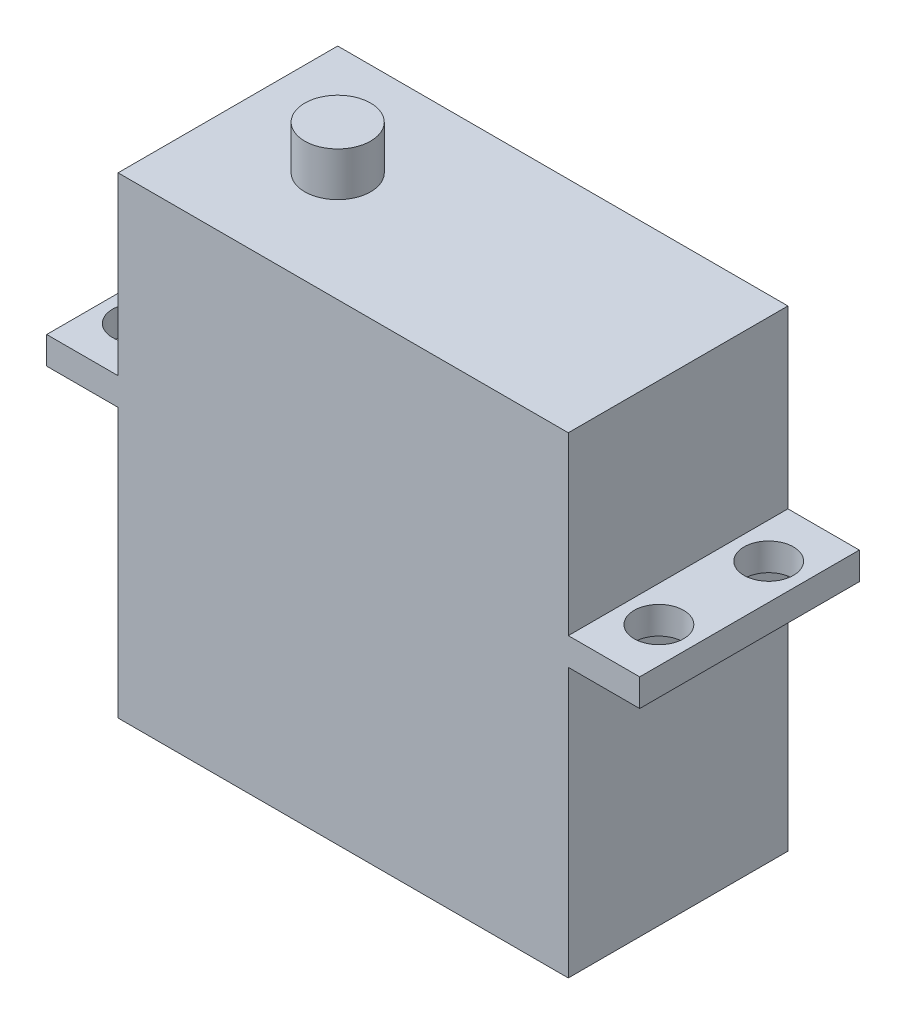
ISO-10303-21;
HEADER;
FILE_DESCRIPTION(('STEP AP214'),'2;1');
FILE_NAME('part.step','',(''),(''),'','','');
FILE_SCHEMA(('AUTOMOTIVE_DESIGN { 1 0 10303 214 1 1 1 1 }'));
ENDSEC;
DATA;
#1=APPLICATION_CONTEXT('core data for automotive mechanical design processes');
#2=APPLICATION_PROTOCOL_DEFINITION('international standard','automotive_design',2000,#1);
#3=PRODUCT_CONTEXT('',#1,'mechanical');
#4=PRODUCT('Part','Part','',(#3));
#5=PRODUCT_RELATED_PRODUCT_CATEGORY('part','',(#4));
#6=PRODUCT_DEFINITION_FORMATION('','',#4);
#7=PRODUCT_DEFINITION_CONTEXT('part definition',#1,'design');
#8=PRODUCT_DEFINITION('design','',#6,#7);
#9=PRODUCT_DEFINITION_SHAPE('','',#8);
#10=(LENGTH_UNIT() NAMED_UNIT(*) SI_UNIT(.MILLI.,.METRE.));
#11=(NAMED_UNIT(*) PLANE_ANGLE_UNIT() SI_UNIT($,.RADIAN.));
#12=(NAMED_UNIT(*) SI_UNIT($,.STERADIAN.) SOLID_ANGLE_UNIT());
#13=UNCERTAINTY_MEASURE_WITH_UNIT(LENGTH_MEASURE(1.E-05),#10,'distance_accuracy_value','');
#14=(GEOMETRIC_REPRESENTATION_CONTEXT(3) GLOBAL_UNCERTAINTY_ASSIGNED_CONTEXT((#13)) GLOBAL_UNIT_ASSIGNED_CONTEXT((#10,
#11,#12)) REPRESENTATION_CONTEXT('',''));
#15=CARTESIAN_POINT('',(0.,0.,0.));
#16=DIRECTION('',(0.,0.,1.));
#17=DIRECTION('',(1.,0.,0.));
#18=AXIS2_PLACEMENT_3D('',#15,#16,#17);
#19=CARTESIAN_POINT('',(-16.5,27.,-10.));
#20=DIRECTION('',(0.,-1.,0.));
#21=DIRECTION('',(0.,0.,-1.));
#22=AXIS2_PLACEMENT_3D('',#19,#20,#21);
#23=PLANE('',#22);
#24=CARTESIAN_POINT('',(-13.2502925364573,27.,5.));
#25=DIRECTION('',(0.,1.,0.));
#26=DIRECTION('',(0.,0.,1.));
#27=AXIS2_PLACEMENT_3D('',#24,#25,#26);
#28=CIRCLE('',#27,2.25);
#29=CARTESIAN_POINT('',(-13.2502925364573,27.,7.25));
#30=VERTEX_POINT('',#29);
#31=EDGE_CURVE('E236',#30,#30,#28,.T.);
#32=ORIENTED_EDGE('',*,*,#31,.F.);
#33=EDGE_LOOP('',(#32));
#34=FACE_BOUND('',#33,.T.);
#35=DIRECTION('',(1.,0.,0.));
#36=VECTOR('',#35,1.);
#37=CARTESIAN_POINT('',(-16.5,27.,10.));
#38=LINE('',#37,#36);
#39=CARTESIAN_POINT('',(-16.5,27.,10.));
#40=VERTEX_POINT('',#39);
#41=CARTESIAN_POINT('',(-10.,27.,10.));
#42=VERTEX_POINT('',#41);
#43=EDGE_CURVE('E165',#40,#42,#38,.T.);
#44=ORIENTED_EDGE('',*,*,#43,.T.);
#45=DIRECTION('',(0.,0.,-1.));
#46=VECTOR('',#45,1.);
#47=CARTESIAN_POINT('',(-10.,27.,-10.));
#48=LINE('',#47,#46);
#49=CARTESIAN_POINT('',(-10.,27.,-10.));
#50=VERTEX_POINT('',#49);
#51=EDGE_CURVE('E192',#42,#50,#48,.T.);
#52=ORIENTED_EDGE('',*,*,#51,.T.);
#53=DIRECTION('',(1.,0.,0.));
#54=VECTOR('',#53,1.);
#55=CARTESIAN_POINT('',(-16.5,27.,-10.));
#56=LINE('',#55,#54);
#57=CARTESIAN_POINT('',(-16.5,27.,-10.));
#58=VERTEX_POINT('',#57);
#59=EDGE_CURVE('E149',#58,#50,#56,.T.);
#60=ORIENTED_EDGE('',*,*,#59,.F.);
#61=DIRECTION('',(0.,0.,1.));
#62=VECTOR('',#61,1.);
#63=CARTESIAN_POINT('',(-16.5,27.,-10.));
#64=LINE('',#63,#62);
#65=EDGE_CURVE('E181',#58,#40,#64,.T.);
#66=ORIENTED_EDGE('',*,*,#65,.T.);
#67=EDGE_LOOP('',(#44,#52,#60,#66));
#68=FACE_BOUND('',#67,.T.);
#69=CARTESIAN_POINT('',(-13.2502925364573,27.,-5.));
#70=DIRECTION('',(0.,1.,0.));
#71=DIRECTION('',(0.,0.,1.));
#72=AXIS2_PLACEMENT_3D('',#69,#70,#71);
#73=CIRCLE('',#72,2.25);
#74=CARTESIAN_POINT('',(-13.2502925364573,27.,-2.75));
#75=VERTEX_POINT('',#74);
#76=EDGE_CURVE('E246',#75,#75,#73,.T.);
#77=ORIENTED_EDGE('',*,*,#76,.F.);
#78=EDGE_LOOP('',(#77));
#79=FACE_BOUND('',#78,.T.);
#80=ADVANCED_FACE('F51',(#34,#68,#79),#23,.F.);
#81=CARTESIAN_POINT('',(-10.,43.,-10.));
#82=DIRECTION('',(1.,0.,0.));
#83=DIRECTION('',(0.,0.,-1.));
#84=AXIS2_PLACEMENT_3D('',#81,#82,#83);
#85=PLANE('',#84);
#86=ORIENTED_EDGE('',*,*,#51,.F.);
#87=DIRECTION('',(0.,-1.,0.));
#88=VECTOR('',#87,1.);
#89=CARTESIAN_POINT('',(-10.,43.,10.));
#90=LINE('',#89,#88);
#91=CARTESIAN_POINT('',(-10.,43.,10.));
#92=VERTEX_POINT('',#91);
#93=EDGE_CURVE('E226',#92,#42,#90,.T.);
#94=ORIENTED_EDGE('',*,*,#93,.F.);
#95=DIRECTION('',(0.,0.,1.));
#96=VECTOR('',#95,1.);
#97=CARTESIAN_POINT('',(-10.,43.,-10.));
#98=LINE('',#97,#96);
#99=CARTESIAN_POINT('',(-10.,43.,-10.));
#100=VERTEX_POINT('',#99);
#101=EDGE_CURVE('E209',#100,#92,#98,.T.);
#102=ORIENTED_EDGE('',*,*,#101,.F.);
#103=DIRECTION('',(0.,-1.,0.));
#104=VECTOR('',#103,1.);
#105=CARTESIAN_POINT('',(-10.,43.,-10.));
#106=LINE('',#105,#104);
#107=EDGE_CURVE('E199',#100,#50,#106,.T.);
#108=ORIENTED_EDGE('',*,*,#107,.T.);
#109=EDGE_LOOP('',(#86,#94,#102,#108));
#110=FACE_BOUND('',#109,.T.);
#111=ADVANCED_FACE('F289',(#110),#85,.F.);
#112=CARTESIAN_POINT('',(31.,43.,-10.));
#113=DIRECTION('',(1.,0.,0.));
#114=DIRECTION('',(0.,0.,-1.));
#115=AXIS2_PLACEMENT_3D('',#112,#113,#114);
#116=PLANE('',#115);
#117=DIRECTION('',(0.,-1.,0.));
#118=VECTOR('',#117,1.);
#119=CARTESIAN_POINT('',(31.,43.,10.));
#120=LINE('',#119,#118);
#121=CARTESIAN_POINT('',(31.,43.,10.));
#122=VERTEX_POINT('',#121);
#123=CARTESIAN_POINT('',(31.,27.,10.));
#124=VERTEX_POINT('',#123);
#125=EDGE_CURVE('E228',#122,#124,#120,.T.);
#126=ORIENTED_EDGE('',*,*,#125,.T.);
#127=DIRECTION('',(0.,0.,-1.));
#128=VECTOR('',#127,1.);
#129=CARTESIAN_POINT('',(31.,27.,-10.));
#130=LINE('',#129,#128);
#131=CARTESIAN_POINT('',(31.,27.,-10.));
#132=VERTEX_POINT('',#131);
#133=EDGE_CURVE('E13',#124,#132,#130,.T.);
#134=ORIENTED_EDGE('',*,*,#133,.T.);
#135=DIRECTION('',(0.,-1.,0.));
#136=VECTOR('',#135,1.);
#137=CARTESIAN_POINT('',(31.,43.,-10.));
#138=LINE('',#137,#136);
#139=CARTESIAN_POINT('',(31.,43.,-10.));
#140=VERTEX_POINT('',#139);
#141=EDGE_CURVE('E235',#140,#132,#138,.T.);
#142=ORIENTED_EDGE('',*,*,#141,.F.);
#143=DIRECTION('',(0.,0.,1.));
#144=VECTOR('',#143,1.);
#145=CARTESIAN_POINT('',(31.,43.,-10.));
#146=LINE('',#145,#144);
#147=EDGE_CURVE('E204',#140,#122,#146,.T.);
#148=ORIENTED_EDGE('',*,*,#147,.T.);
#149=EDGE_LOOP('',(#126,#134,#142,#148));
#150=FACE_BOUND('',#149,.T.);
#151=ADVANCED_FACE('F281',(#150),#116,.T.);
#152=CARTESIAN_POINT('',(-10.,43.,-10.));
#153=DIRECTION('',(0.,0.,-1.));
#154=DIRECTION('',(-1.,0.,0.));
#155=AXIS2_PLACEMENT_3D('',#152,#153,#154);
#156=PLANE('',#155);
#157=ORIENTED_EDGE('',*,*,#141,.T.);
#158=CARTESIAN_POINT('',(37.5,27.,-10.));
#159=VERTEX_POINT('',#158);
#160=EDGE_CURVE('E178',#132,#159,#56,.T.);
#161=ORIENTED_EDGE('',*,*,#160,.T.);
#162=DIRECTION('',(0.,-1.,0.));
#163=VECTOR('',#162,1.);
#164=CARTESIAN_POINT('',(37.5,27.,-10.));
#165=LINE('',#164,#163);
#166=CARTESIAN_POINT('',(37.5,24.5,-10.));
#167=VERTEX_POINT('',#166);
#168=EDGE_CURVE('E180',#159,#167,#165,.T.);
#169=ORIENTED_EDGE('',*,*,#168,.T.);
#170=DIRECTION('',(1.,0.,0.));
#171=VECTOR('',#170,1.);
#172=CARTESIAN_POINT('',(-16.5,24.5,-10.));
#173=LINE('',#172,#171);
#174=CARTESIAN_POINT('',(31.,24.5,-10.));
#175=VERTEX_POINT('',#174);
#176=EDGE_CURVE('E174',#175,#167,#173,.T.);
#177=ORIENTED_EDGE('',*,*,#176,.F.);
#178=CARTESIAN_POINT('',(31.,0.,-10.));
#179=VERTEX_POINT('',#178);
#180=EDGE_CURVE('E215',#175,#179,#138,.T.);
#181=ORIENTED_EDGE('',*,*,#180,.T.);
#182=DIRECTION('',(1.,0.,0.));
#183=VECTOR('',#182,1.);
#184=CARTESIAN_POINT('',(-10.,0.,-10.));
#185=LINE('',#184,#183);
#186=CARTESIAN_POINT('',(-10.,0.,-10.));
#187=VERTEX_POINT('',#186);
#188=EDGE_CURVE('E198',#187,#179,#185,.T.);
#189=ORIENTED_EDGE('',*,*,#188,.F.);
#190=CARTESIAN_POINT('',(-10.,24.5,-10.));
#191=VERTEX_POINT('',#190);
#192=EDGE_CURVE('E223',#191,#187,#106,.T.);
#193=ORIENTED_EDGE('',*,*,#192,.F.);
#194=CARTESIAN_POINT('',(-16.5,24.5,-10.));
#195=VERTEX_POINT('',#194);
#196=EDGE_CURVE('E69',#195,#191,#173,.T.);
#197=ORIENTED_EDGE('',*,*,#196,.F.);
#198=DIRECTION('',(0.,-1.,0.));
#199=VECTOR('',#198,1.);
#200=CARTESIAN_POINT('',(-16.5,27.,-10.));
#201=LINE('',#200,#199);
#202=EDGE_CURVE('E150',#58,#195,#201,.T.);
#203=ORIENTED_EDGE('',*,*,#202,.F.);
#204=ORIENTED_EDGE('',*,*,#59,.T.);
#205=ORIENTED_EDGE('',*,*,#107,.F.);
#206=DIRECTION('',(1.,0.,0.));
#207=VECTOR('',#206,1.);
#208=CARTESIAN_POINT('',(-10.,43.,-10.));
#209=LINE('',#208,#207);
#210=EDGE_CURVE('E203',#100,#140,#209,.T.);
#211=ORIENTED_EDGE('',*,*,#210,.T.);
#212=EDGE_LOOP('',(#157,#161,#169,#177,#181,#189,#193,#197,#203,#204,#205,#211));
#213=FACE_BOUND('',#212,.T.);
#214=ADVANCED_FACE('F52',(#213),#156,.T.);
#215=CARTESIAN_POINT('',(-10.,24.5,10.));
#216=VERTEX_POINT('',#215);
#217=CARTESIAN_POINT('',(-10.,0.,10.));
#218=VERTEX_POINT('',#217);
#219=EDGE_CURVE('E227',#216,#218,#90,.T.);
#220=ORIENTED_EDGE('',*,*,#219,.F.);
#221=DIRECTION('',(0.,0.,-1.));
#222=VECTOR('',#221,1.);
#223=CARTESIAN_POINT('',(-10.,24.5,-10.));
#224=LINE('',#223,#222);
#225=EDGE_CURVE('E152',#216,#191,#224,.T.);
#226=ORIENTED_EDGE('',*,*,#225,.T.);
#227=ORIENTED_EDGE('',*,*,#192,.T.);
#228=DIRECTION('',(0.,0.,1.));
#229=VECTOR('',#228,1.);
#230=CARTESIAN_POINT('',(-10.,0.,-10.));
#231=LINE('',#230,#229);
#232=EDGE_CURVE('E202',#187,#218,#231,.T.);
#233=ORIENTED_EDGE('',*,*,#232,.T.);
#234=EDGE_LOOP('',(#220,#226,#227,#233));
#235=FACE_BOUND('',#234,.T.);
#236=ADVANCED_FACE('F296',(#235),#85,.F.);
#237=CARTESIAN_POINT('',(-10.,43.,10.));
#238=DIRECTION('',(0.,0.,-1.));
#239=DIRECTION('',(-1.,0.,0.));
#240=AXIS2_PLACEMENT_3D('',#237,#238,#239);
#241=PLANE('',#240);
#242=ORIENTED_EDGE('',*,*,#93,.T.);
#243=ORIENTED_EDGE('',*,*,#43,.F.);
#244=DIRECTION('',(0.,-1.,0.));
#245=VECTOR('',#244,1.);
#246=CARTESIAN_POINT('',(-16.5,27.,10.));
#247=LINE('',#246,#245);
#248=CARTESIAN_POINT('',(-16.5,24.5,10.));
#249=VERTEX_POINT('',#248);
#250=EDGE_CURVE('E145',#40,#249,#247,.T.);
#251=ORIENTED_EDGE('',*,*,#250,.T.);
#252=DIRECTION('',(1.,0.,0.));
#253=VECTOR('',#252,1.);
#254=CARTESIAN_POINT('',(-16.5,24.5,10.));
#255=LINE('',#254,#253);
#256=EDGE_CURVE('E155',#249,#216,#255,.T.);
#257=ORIENTED_EDGE('',*,*,#256,.T.);
#258=ORIENTED_EDGE('',*,*,#219,.T.);
#259=DIRECTION('',(1.,0.,0.));
#260=VECTOR('',#259,1.);
#261=CARTESIAN_POINT('',(-10.,0.,10.));
#262=LINE('',#261,#260);
#263=CARTESIAN_POINT('',(31.,0.,10.));
#264=VERTEX_POINT('',#263);
#265=EDGE_CURVE('E217',#218,#264,#262,.T.);
#266=ORIENTED_EDGE('',*,*,#265,.T.);
#267=CARTESIAN_POINT('',(31.,24.5,10.));
#268=VERTEX_POINT('',#267);
#269=EDGE_CURVE('E232',#268,#264,#120,.T.);
#270=ORIENTED_EDGE('',*,*,#269,.F.);
#271=CARTESIAN_POINT('',(37.5,24.5,10.));
#272=VERTEX_POINT('',#271);
#273=EDGE_CURVE('E158',#268,#272,#255,.T.);
#274=ORIENTED_EDGE('',*,*,#273,.T.);
#275=DIRECTION('',(0.,-1.,0.));
#276=VECTOR('',#275,1.);
#277=CARTESIAN_POINT('',(37.5,27.,10.));
#278=LINE('',#277,#276);
#279=CARTESIAN_POINT('',(37.5,27.,10.));
#280=VERTEX_POINT('',#279);
#281=EDGE_CURVE('E160',#280,#272,#278,.T.);
#282=ORIENTED_EDGE('',*,*,#281,.F.);
#283=EDGE_CURVE('E175',#124,#280,#38,.T.);
#284=ORIENTED_EDGE('',*,*,#283,.F.);
#285=ORIENTED_EDGE('',*,*,#125,.F.);
#286=DIRECTION('',(1.,0.,0.));
#287=VECTOR('',#286,1.);
#288=CARTESIAN_POINT('',(-10.,43.,10.));
#289=LINE('',#288,#287);
#290=EDGE_CURVE('E208',#92,#122,#289,.T.);
#291=ORIENTED_EDGE('',*,*,#290,.F.);
#292=EDGE_LOOP('',(#242,#243,#251,#257,#258,#266,#270,#274,#282,#284,#285,#291));
#293=FACE_BOUND('',#292,.T.);
#294=ADVANCED_FACE('F161',(#293),#241,.F.);
#295=DIRECTION('',(0.,0.,-1.));
#296=VECTOR('',#295,1.);
#297=CARTESIAN_POINT('',(31.,24.5,-10.));
#298=LINE('',#297,#296);
#299=EDGE_CURVE('E58',#268,#175,#298,.T.);
#300=ORIENTED_EDGE('',*,*,#299,.F.);
#301=ORIENTED_EDGE('',*,*,#269,.T.);
#302=DIRECTION('',(0.,0.,1.));
#303=VECTOR('',#302,1.);
#304=CARTESIAN_POINT('',(31.,0.,-10.));
#305=LINE('',#304,#303);
#306=EDGE_CURVE('E214',#179,#264,#305,.T.);
#307=ORIENTED_EDGE('',*,*,#306,.F.);
#308=ORIENTED_EDGE('',*,*,#180,.F.);
#309=EDGE_LOOP('',(#300,#301,#307,#308));
#310=FACE_BOUND('',#309,.T.);
#311=ADVANCED_FACE('F395',(#310),#116,.T.);
#312=CARTESIAN_POINT('',(0.,43.,0.));
#313=DIRECTION('',(0.,-1.,0.));
#314=DIRECTION('',(0.,0.,-1.));
#315=AXIS2_PLACEMENT_3D('',#312,#313,#314);
#316=PLANE('',#315);
#317=CARTESIAN_POINT('',(0.,43.,0.));
#318=DIRECTION('',(0.,1.,0.));
#319=DIRECTION('',(0.,0.,1.));
#320=AXIS2_PLACEMENT_3D('',#317,#318,#319);
#321=CIRCLE('',#320,3.);
#322=CARTESIAN_POINT('',(0.,43.,3.));
#323=VERTEX_POINT('',#322);
#324=EDGE_CURVE('E197',#323,#323,#321,.T.);
#325=ORIENTED_EDGE('',*,*,#324,.F.);
#326=EDGE_LOOP('',(#325));
#327=FACE_BOUND('',#326,.T.);
#328=ORIENTED_EDGE('',*,*,#210,.F.);
#329=ORIENTED_EDGE('',*,*,#101,.T.);
#330=ORIENTED_EDGE('',*,*,#290,.T.);
#331=ORIENTED_EDGE('',*,*,#147,.F.);
#332=EDGE_LOOP('',(#328,#329,#330,#331));
#333=FACE_BOUND('',#332,.T.);
#334=ADVANCED_FACE('F282',(#327,#333),#316,.F.);
#335=CARTESIAN_POINT('',(0.,0.,0.));
#336=DIRECTION('',(0.,-1.,0.));
#337=DIRECTION('',(0.,0.,-1.));
#338=AXIS2_PLACEMENT_3D('',#335,#336,#337);
#339=PLANE('',#338);
#340=ORIENTED_EDGE('',*,*,#188,.T.);
#341=ORIENTED_EDGE('',*,*,#306,.T.);
#342=ORIENTED_EDGE('',*,*,#265,.F.);
#343=ORIENTED_EDGE('',*,*,#232,.F.);
#344=EDGE_LOOP('',(#340,#341,#342,#343));
#345=FACE_BOUND('',#344,.T.);
#346=ADVANCED_FACE('F298',(#345),#339,.T.);
#347=CARTESIAN_POINT('',(0.,47.,0.));
#348=DIRECTION('',(0.,-1.,0.));
#349=DIRECTION('',(0.,0.,-1.));
#350=AXIS2_PLACEMENT_3D('',#347,#348,#349);
#351=CYLINDRICAL_SURFACE('',#350,3.);
#352=CARTESIAN_POINT('',(0.,47.,0.));
#353=DIRECTION('',(0.,1.,0.));
#354=DIRECTION('',(0.,0.,1.));
#355=AXIS2_PLACEMENT_3D('',#352,#353,#354);
#356=CIRCLE('',#355,3.);
#357=CARTESIAN_POINT('',(0.,47.,3.));
#358=VERTEX_POINT('',#357);
#359=EDGE_CURVE('E194',#358,#358,#356,.T.);
#360=ORIENTED_EDGE('',*,*,#359,.F.);
#361=EDGE_LOOP('',(#360));
#362=FACE_BOUND('',#361,.T.);
#363=ORIENTED_EDGE('',*,*,#324,.T.);
#364=EDGE_LOOP('',(#363));
#365=FACE_BOUND('',#364,.T.);
#366=ADVANCED_FACE('F430',(#362,#365),#351,.T.);
#367=CARTESIAN_POINT('',(0.,47.,0.));
#368=DIRECTION('',(0.,1.,0.));
#369=DIRECTION('',(0.,0.,1.));
#370=AXIS2_PLACEMENT_3D('',#367,#368,#369);
#371=PLANE('',#370);
#372=ORIENTED_EDGE('',*,*,#359,.T.);
#373=EDGE_LOOP('',(#372));
#374=FACE_BOUND('',#373,.T.);
#375=ADVANCED_FACE('F310',(#374),#371,.T.);
#376=CARTESIAN_POINT('',(37.5,27.,-10.));
#377=DIRECTION('',(-1.,0.,0.));
#378=DIRECTION('',(0.,0.,1.));
#379=AXIS2_PLACEMENT_3D('',#376,#377,#378);
#380=PLANE('',#379);
#381=DIRECTION('',(0.,0.,1.));
#382=VECTOR('',#381,1.);
#383=CARTESIAN_POINT('',(37.5,27.,-10.));
#384=LINE('',#383,#382);
#385=EDGE_CURVE('E183',#159,#280,#384,.T.);
#386=ORIENTED_EDGE('',*,*,#385,.T.);
#387=ORIENTED_EDGE('',*,*,#281,.T.);
#388=DIRECTION('',(0.,0.,1.));
#389=VECTOR('',#388,1.);
#390=CARTESIAN_POINT('',(37.5,24.5,-10.));
#391=LINE('',#390,#389);
#392=EDGE_CURVE('E146',#167,#272,#391,.T.);
#393=ORIENTED_EDGE('',*,*,#392,.F.);
#394=ORIENTED_EDGE('',*,*,#168,.F.);
#395=EDGE_LOOP('',(#386,#387,#393,#394));
#396=FACE_BOUND('',#395,.T.);
#397=ADVANCED_FACE('F274',(#396),#380,.F.);
#398=CARTESIAN_POINT('',(-16.5,24.5,-10.));
#399=DIRECTION('',(0.,-1.,0.));
#400=DIRECTION('',(0.,0.,-1.));
#401=AXIS2_PLACEMENT_3D('',#398,#399,#400);
#402=PLANE('',#401);
#403=CARTESIAN_POINT('',(34.2502925364573,24.5,-5.));
#404=DIRECTION('',(0.,-1.,0.));
#405=DIRECTION('',(0.,0.,-1.));
#406=AXIS2_PLACEMENT_3D('',#403,#404,#405);
#407=CIRCLE('',#406,2.25);
#408=CARTESIAN_POINT('',(34.2502925364573,24.5,-7.25));
#409=VERTEX_POINT('',#408);
#410=EDGE_CURVE('E245',#409,#409,#407,.T.);
#411=ORIENTED_EDGE('',*,*,#410,.F.);
#412=EDGE_LOOP('',(#411));
#413=FACE_BOUND('',#412,.T.);
#414=CARTESIAN_POINT('',(34.2502925364573,24.5,5.));
#415=DIRECTION('',(0.,-1.,0.));
#416=DIRECTION('',(0.,0.,-1.));
#417=AXIS2_PLACEMENT_3D('',#414,#415,#416);
#418=CIRCLE('',#417,2.25);
#419=CARTESIAN_POINT('',(34.2502925364573,24.5,2.75000000000001));
#420=VERTEX_POINT('',#419);
#421=EDGE_CURVE('E162',#420,#420,#418,.T.);
#422=ORIENTED_EDGE('',*,*,#421,.F.);
#423=EDGE_LOOP('',(#422));
#424=FACE_BOUND('',#423,.T.);
#425=ORIENTED_EDGE('',*,*,#273,.F.);
#426=ORIENTED_EDGE('',*,*,#299,.T.);
#427=ORIENTED_EDGE('',*,*,#176,.T.);
#428=ORIENTED_EDGE('',*,*,#392,.T.);
#429=EDGE_LOOP('',(#425,#426,#427,#428));
#430=FACE_BOUND('',#429,.T.);
#431=ADVANCED_FACE('F261',(#413,#424,#430),#402,.T.);
#432=CARTESIAN_POINT('',(34.2502925364573,27.,-5.));
#433=DIRECTION('',(0.,1.,0.));
#434=DIRECTION('',(0.,0.,1.));
#435=AXIS2_PLACEMENT_3D('',#432,#433,#434);
#436=CIRCLE('',#435,2.25);
#437=CARTESIAN_POINT('',(34.2502925364573,27.,-2.75000000000001));
#438=VERTEX_POINT('',#437);
#439=EDGE_CURVE('E240',#438,#438,#436,.T.);
#440=ORIENTED_EDGE('',*,*,#439,.F.);
#441=EDGE_LOOP('',(#440));
#442=FACE_BOUND('',#441,.T.);
#443=CARTESIAN_POINT('',(34.2502925364573,27.,5.));
#444=DIRECTION('',(0.,1.,0.));
#445=DIRECTION('',(0.,0.,1.));
#446=AXIS2_PLACEMENT_3D('',#443,#444,#445);
#447=CIRCLE('',#446,2.25);
#448=CARTESIAN_POINT('',(34.2502925364573,27.,7.25));
#449=VERTEX_POINT('',#448);
#450=EDGE_CURVE('E167',#449,#449,#447,.T.);
#451=ORIENTED_EDGE('',*,*,#450,.F.);
#452=EDGE_LOOP('',(#451));
#453=FACE_BOUND('',#452,.T.);
#454=ORIENTED_EDGE('',*,*,#133,.F.);
#455=ORIENTED_EDGE('',*,*,#283,.T.);
#456=ORIENTED_EDGE('',*,*,#385,.F.);
#457=ORIENTED_EDGE('',*,*,#160,.F.);
#458=EDGE_LOOP('',(#454,#455,#456,#457));
#459=FACE_BOUND('',#458,.T.);
#460=ADVANCED_FACE('F256',(#442,#453,#459),#23,.F.);
#461=CARTESIAN_POINT('',(-13.2502925364573,24.5,-5.));
#462=DIRECTION('',(0.,-1.,0.));
#463=DIRECTION('',(0.,0.,-1.));
#464=AXIS2_PLACEMENT_3D('',#461,#462,#463);
#465=CIRCLE('',#464,2.25);
#466=CARTESIAN_POINT('',(-13.2502925364573,24.5,-7.25));
#467=VERTEX_POINT('',#466);
#468=EDGE_CURVE('E54',#467,#467,#465,.T.);
#469=ORIENTED_EDGE('',*,*,#468,.F.);
#470=EDGE_LOOP('',(#469));
#471=FACE_BOUND('',#470,.T.);
#472=CARTESIAN_POINT('',(-13.2502925364573,24.5,5.));
#473=DIRECTION('',(0.,-1.,0.));
#474=DIRECTION('',(0.,0.,-1.));
#475=AXIS2_PLACEMENT_3D('',#472,#473,#474);
#476=CIRCLE('',#475,2.25);
#477=CARTESIAN_POINT('',(-13.2502925364573,24.5,2.75));
#478=VERTEX_POINT('',#477);
#479=EDGE_CURVE('E233',#478,#478,#476,.T.);
#480=ORIENTED_EDGE('',*,*,#479,.F.);
#481=EDGE_LOOP('',(#480));
#482=FACE_BOUND('',#481,.T.);
#483=ORIENTED_EDGE('',*,*,#225,.F.);
#484=ORIENTED_EDGE('',*,*,#256,.F.);
#485=DIRECTION('',(0.,0.,1.));
#486=VECTOR('',#485,1.);
#487=CARTESIAN_POINT('',(-16.5,24.5,-10.));
#488=LINE('',#487,#486);
#489=EDGE_CURVE('E138',#195,#249,#488,.T.);
#490=ORIENTED_EDGE('',*,*,#489,.F.);
#491=ORIENTED_EDGE('',*,*,#196,.T.);
#492=EDGE_LOOP('',(#483,#484,#490,#491));
#493=FACE_BOUND('',#492,.T.);
#494=ADVANCED_FACE('F153',(#471,#482,#493),#402,.T.);
#495=CARTESIAN_POINT('',(-16.5,27.,-10.));
#496=DIRECTION('',(-1.,0.,0.));
#497=DIRECTION('',(0.,0.,1.));
#498=AXIS2_PLACEMENT_3D('',#495,#496,#497);
#499=PLANE('',#498);
#500=ORIENTED_EDGE('',*,*,#489,.T.);
#501=ORIENTED_EDGE('',*,*,#250,.F.);
#502=ORIENTED_EDGE('',*,*,#65,.F.);
#503=ORIENTED_EDGE('',*,*,#202,.T.);
#504=EDGE_LOOP('',(#500,#501,#502,#503));
#505=FACE_BOUND('',#504,.T.);
#506=ADVANCED_FACE('F142',(#505),#499,.T.);
#507=CARTESIAN_POINT('',(34.2502925364573,27.,5.));
#508=DIRECTION('',(0.,1.,0.));
#509=DIRECTION('',(0.,0.,1.));
#510=AXIS2_PLACEMENT_3D('',#507,#508,#509);
#511=CYLINDRICAL_SURFACE('',#510,2.25);
#512=ORIENTED_EDGE('',*,*,#421,.T.);
#513=EDGE_LOOP('',(#512));
#514=FACE_BOUND('',#513,.T.);
#515=ORIENTED_EDGE('',*,*,#450,.T.);
#516=EDGE_LOOP('',(#515));
#517=FACE_BOUND('',#516,.T.);
#518=ADVANCED_FACE('F258',(#514,#517),#511,.F.);
#519=CARTESIAN_POINT('',(34.2502925364573,27.,-5.));
#520=DIRECTION('',(0.,1.,0.));
#521=DIRECTION('',(0.,0.,1.));
#522=AXIS2_PLACEMENT_3D('',#519,#520,#521);
#523=CYLINDRICAL_SURFACE('',#522,2.25);
#524=ORIENTED_EDGE('',*,*,#410,.T.);
#525=EDGE_LOOP('',(#524));
#526=FACE_BOUND('',#525,.T.);
#527=ORIENTED_EDGE('',*,*,#439,.T.);
#528=EDGE_LOOP('',(#527));
#529=FACE_BOUND('',#528,.T.);
#530=ADVANCED_FACE('F324',(#526,#529),#523,.F.);
#531=CARTESIAN_POINT('',(-13.2502925364573,27.,5.));
#532=DIRECTION('',(0.,1.,0.));
#533=DIRECTION('',(0.,0.,1.));
#534=AXIS2_PLACEMENT_3D('',#531,#532,#533);
#535=CYLINDRICAL_SURFACE('',#534,2.25);
#536=ORIENTED_EDGE('',*,*,#479,.T.);
#537=EDGE_LOOP('',(#536));
#538=FACE_BOUND('',#537,.T.);
#539=ORIENTED_EDGE('',*,*,#31,.T.);
#540=EDGE_LOOP('',(#539));
#541=FACE_BOUND('',#540,.T.);
#542=ADVANCED_FACE('F328',(#538,#541),#535,.F.);
#543=CARTESIAN_POINT('',(-13.2502925364573,27.,-5.));
#544=DIRECTION('',(0.,1.,0.));
#545=DIRECTION('',(0.,0.,1.));
#546=AXIS2_PLACEMENT_3D('',#543,#544,#545);
#547=CYLINDRICAL_SURFACE('',#546,2.25);
#548=ORIENTED_EDGE('',*,*,#468,.T.);
#549=EDGE_LOOP('',(#548));
#550=FACE_BOUND('',#549,.T.);
#551=ORIENTED_EDGE('',*,*,#76,.T.);
#552=EDGE_LOOP('',(#551));
#553=FACE_BOUND('',#552,.T.);
#554=ADVANCED_FACE('F334',(#550,#553),#547,.F.);
#555=CLOSED_SHELL('',(#80,#111,#151,#214,#236,#294,#311,#334,#346,#366,#375,#397,#431,#460,#494,
#506,#518,#530,#542,#554));
#556=MANIFOLD_SOLID_BREP('B2',#555);
#557=ADVANCED_BREP_SHAPE_REPRESENTATION('',(#18,#556),#14);
#558=SHAPE_DEFINITION_REPRESENTATION(#9,#557);
ENDSEC;
END-ISO-10303-21;
